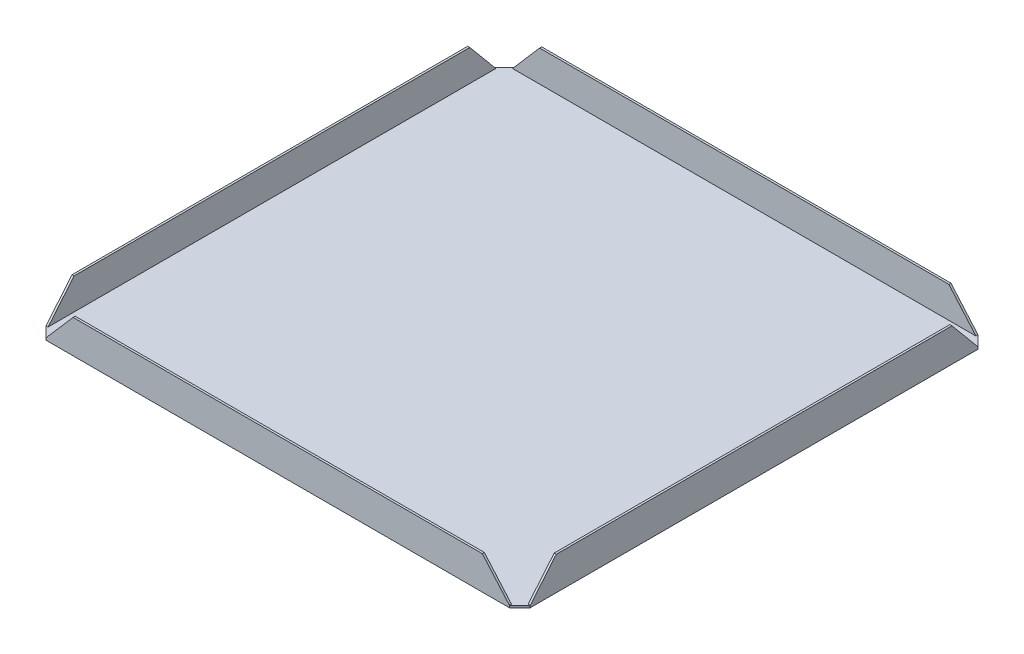
ISO-10303-21;
HEADER;
FILE_DESCRIPTION(('STEP AP214'),'2;1');
FILE_NAME('part.step','',(''),(''),'','','');
FILE_SCHEMA(('AUTOMOTIVE_DESIGN { 1 0 10303 214 1 1 1 1 }'));
ENDSEC;
DATA;
#1=APPLICATION_CONTEXT('core data for automotive mechanical design processes');
#2=APPLICATION_PROTOCOL_DEFINITION('international standard','automotive_design',2000,#1);
#3=PRODUCT_CONTEXT('',#1,'mechanical');
#4=PRODUCT('Part','Part','',(#3));
#5=PRODUCT_RELATED_PRODUCT_CATEGORY('part','',(#4));
#6=PRODUCT_DEFINITION_FORMATION('','',#4);
#7=PRODUCT_DEFINITION_CONTEXT('part definition',#1,'design');
#8=PRODUCT_DEFINITION('design','',#6,#7);
#9=PRODUCT_DEFINITION_SHAPE('','',#8);
#10=(LENGTH_UNIT() NAMED_UNIT(*) SI_UNIT(.MILLI.,.METRE.));
#11=(NAMED_UNIT(*) PLANE_ANGLE_UNIT() SI_UNIT($,.RADIAN.));
#12=(NAMED_UNIT(*) SI_UNIT($,.STERADIAN.) SOLID_ANGLE_UNIT());
#13=UNCERTAINTY_MEASURE_WITH_UNIT(LENGTH_MEASURE(1.E-05),#10,'distance_accuracy_value','');
#14=(GEOMETRIC_REPRESENTATION_CONTEXT(3) GLOBAL_UNCERTAINTY_ASSIGNED_CONTEXT((#13)) GLOBAL_UNIT_ASSIGNED_CONTEXT((#10,
#11,#12)) REPRESENTATION_CONTEXT('',''));
#15=CARTESIAN_POINT('',(0.,0.,0.));
#16=DIRECTION('',(0.,0.,1.));
#17=DIRECTION('',(1.,0.,0.));
#18=AXIS2_PLACEMENT_3D('',#15,#16,#17);
#19=CARTESIAN_POINT('',(0.,2.,0.));
#20=DIRECTION('',(0.,1.,0.));
#21=DIRECTION('',(0.,0.,1.));
#22=AXIS2_PLACEMENT_3D('',#19,#20,#21);
#23=PLANE('',#22);
#24=DIRECTION('',(1.,0.,0.));
#25=VECTOR('',#24,1.);
#26=CARTESIAN_POINT('',(-222.5,2.,-223.));
#27=LINE('',#26,#25);
#28=CARTESIAN_POINT('',(-222.5,2.,-223.));
#29=VERTEX_POINT('',#28);
#30=CARTESIAN_POINT('',(222.5,2.,-223.));
#31=VERTEX_POINT('',#30);
#32=EDGE_CURVE('E51',#29,#31,#27,.T.);
#33=ORIENTED_EDGE('',*,*,#32,.F.);
#34=DIRECTION('',(0.,0.,-1.));
#35=VECTOR('',#34,1.);
#36=CARTESIAN_POINT('',(-222.5,2.,-223.));
#37=LINE('',#36,#35);
#38=CARTESIAN_POINT('',(-222.5,2.,-225.));
#39=VERTEX_POINT('',#38);
#40=EDGE_CURVE('E190',#29,#39,#37,.T.);
#41=ORIENTED_EDGE('',*,*,#40,.T.);
#42=DIRECTION('',(-0.707106781186547,0.,0.707106781186547));
#43=VECTOR('',#42,1.);
#44=CARTESIAN_POINT('',(-232.5,2.,-215.));
#45=LINE('',#44,#43);
#46=CARTESIAN_POINT('',(-232.5,2.,-215.));
#47=VERTEX_POINT('',#46);
#48=EDGE_CURVE('E293',#39,#47,#45,.T.);
#49=ORIENTED_EDGE('',*,*,#48,.T.);
#50=DIRECTION('',(-1.,0.,0.));
#51=VECTOR('',#50,1.);
#52=CARTESIAN_POINT('',(-230.5,2.,-215.));
#53=LINE('',#52,#51);
#54=CARTESIAN_POINT('',(-230.5,2.,-215.));
#55=VERTEX_POINT('',#54);
#56=EDGE_CURVE('E245',#55,#47,#53,.T.);
#57=ORIENTED_EDGE('',*,*,#56,.F.);
#58=DIRECTION('',(0.,0.,1.));
#59=VECTOR('',#58,1.);
#60=CARTESIAN_POINT('',(-230.5,2.,-215.));
#61=LINE('',#60,#59);
#62=CARTESIAN_POINT('',(-230.5,2.,215.));
#63=VERTEX_POINT('',#62);
#64=EDGE_CURVE('E236',#55,#63,#61,.T.);
#65=ORIENTED_EDGE('',*,*,#64,.T.);
#66=DIRECTION('',(-1.,0.,0.));
#67=VECTOR('',#66,1.);
#68=CARTESIAN_POINT('',(-230.5,2.,215.));
#69=LINE('',#68,#67);
#70=CARTESIAN_POINT('',(-232.5,2.,215.));
#71=VERTEX_POINT('',#70);
#72=EDGE_CURVE('E258',#63,#71,#69,.T.);
#73=ORIENTED_EDGE('',*,*,#72,.T.);
#74=DIRECTION('',(0.707106781186547,0.,0.707106781186547));
#75=VECTOR('',#74,1.);
#76=CARTESIAN_POINT('',(-222.5,2.,225.));
#77=LINE('',#76,#75);
#78=CARTESIAN_POINT('',(-222.5,2.,225.));
#79=VERTEX_POINT('',#78);
#80=EDGE_CURVE('E295',#71,#79,#77,.T.);
#81=ORIENTED_EDGE('',*,*,#80,.T.);
#82=DIRECTION('',(0.,0.,1.));
#83=VECTOR('',#82,1.);
#84=CARTESIAN_POINT('',(-222.5,2.,223.));
#85=LINE('',#84,#83);
#86=CARTESIAN_POINT('',(-222.5,2.,223.));
#87=VERTEX_POINT('',#86);
#88=EDGE_CURVE('E276',#87,#79,#85,.T.);
#89=ORIENTED_EDGE('',*,*,#88,.F.);
#90=DIRECTION('',(1.,0.,0.));
#91=VECTOR('',#90,1.);
#92=CARTESIAN_POINT('',(-222.5,2.,223.));
#93=LINE('',#92,#91);
#94=CARTESIAN_POINT('',(222.5,2.,223.));
#95=VERTEX_POINT('',#94);
#96=EDGE_CURVE('E266',#87,#95,#93,.T.);
#97=ORIENTED_EDGE('',*,*,#96,.T.);
#98=DIRECTION('',(0.,0.,1.));
#99=VECTOR('',#98,1.);
#100=CARTESIAN_POINT('',(222.5,2.,223.));
#101=LINE('',#100,#99);
#102=CARTESIAN_POINT('',(222.5,2.,225.));
#103=VERTEX_POINT('',#102);
#104=EDGE_CURVE('E289',#95,#103,#101,.T.);
#105=ORIENTED_EDGE('',*,*,#104,.T.);
#106=DIRECTION('',(0.707106781186547,0.,-0.707106781186547));
#107=VECTOR('',#106,1.);
#108=CARTESIAN_POINT('',(222.5,2.,225.));
#109=LINE('',#108,#107);
#110=CARTESIAN_POINT('',(232.5,2.,215.));
#111=VERTEX_POINT('',#110);
#112=EDGE_CURVE('E299',#103,#111,#109,.T.);
#113=ORIENTED_EDGE('',*,*,#112,.T.);
#114=DIRECTION('',(1.,0.,0.));
#115=VECTOR('',#114,1.);
#116=CARTESIAN_POINT('',(230.5,2.,215.));
#117=LINE('',#116,#115);
#118=CARTESIAN_POINT('',(230.5,2.,215.));
#119=VERTEX_POINT('',#118);
#120=EDGE_CURVE('E225',#119,#111,#117,.T.);
#121=ORIENTED_EDGE('',*,*,#120,.F.);
#122=DIRECTION('',(0.,0.,1.));
#123=VECTOR('',#122,1.);
#124=CARTESIAN_POINT('',(230.5,2.,-215.));
#125=LINE('',#124,#123);
#126=CARTESIAN_POINT('',(230.5,2.,-215.));
#127=VERTEX_POINT('',#126);
#128=EDGE_CURVE('E212',#127,#119,#125,.T.);
#129=ORIENTED_EDGE('',*,*,#128,.F.);
#130=DIRECTION('',(1.,0.,0.));
#131=VECTOR('',#130,1.);
#132=CARTESIAN_POINT('',(230.5,2.,-215.));
#133=LINE('',#132,#131);
#134=CARTESIAN_POINT('',(232.5,2.,-215.));
#135=VERTEX_POINT('',#134);
#136=EDGE_CURVE('E221',#127,#135,#133,.T.);
#137=ORIENTED_EDGE('',*,*,#136,.T.);
#138=DIRECTION('',(-0.707106781186547,0.,-0.707106781186547));
#139=VECTOR('',#138,1.);
#140=CARTESIAN_POINT('',(222.5,2.,-225.));
#141=LINE('',#140,#139);
#142=CARTESIAN_POINT('',(222.5,2.,-225.));
#143=VERTEX_POINT('',#142);
#144=EDGE_CURVE('E301',#135,#143,#141,.T.);
#145=ORIENTED_EDGE('',*,*,#144,.T.);
#146=DIRECTION('',(0.,0.,-1.));
#147=VECTOR('',#146,1.);
#148=CARTESIAN_POINT('',(222.5,2.,-223.));
#149=LINE('',#148,#147);
#150=EDGE_CURVE('E47',#31,#143,#149,.T.);
#151=ORIENTED_EDGE('',*,*,#150,.F.);
#152=EDGE_LOOP('',(#33,#41,#49,#57,#65,#73,#81,#89,#97,#105,#113,#121,#129,#137,#145,#151));
#153=FACE_BOUND('',#152,.T.);
#154=ADVANCED_FACE('F32',(#153),#23,.T.);
#155=CARTESIAN_POINT('',(-222.5,2.,-225.));
#156=DIRECTION('',(0.,0.,1.));
#157=DIRECTION('',(1.,0.,0.));
#158=AXIS2_PLACEMENT_3D('',#155,#156,#157);
#159=PLANE('',#158);
#160=DIRECTION('',(-1.,0.,0.));
#161=VECTOR('',#160,1.);
#162=CARTESIAN_POINT('',(-222.5,0.,-225.));
#163=LINE('',#162,#161);
#164=CARTESIAN_POINT('',(222.5,0.,-225.));
#165=VERTEX_POINT('',#164);
#166=CARTESIAN_POINT('',(-222.5,0.,-225.));
#167=VERTEX_POINT('',#166);
#168=EDGE_CURVE('E286',#165,#167,#163,.T.);
#169=ORIENTED_EDGE('',*,*,#168,.T.);
#170=DIRECTION('',(0.,-1.,0.));
#171=VECTOR('',#170,1.);
#172=CARTESIAN_POINT('',(-222.5,2.,-225.));
#173=LINE('',#172,#171);
#174=EDGE_CURVE('E11',#39,#167,#173,.T.);
#175=ORIENTED_EDGE('',*,*,#174,.F.);
#176=DIRECTION('',(-0.654930538417843,-0.755689082789816,0.));
#177=VECTOR('',#176,1.);
#178=CARTESIAN_POINT('',(-196.5,31.9999999999999,-225.));
#179=LINE('',#178,#177);
#180=CARTESIAN_POINT('',(-196.5,31.9999999999999,-225.));
#181=VERTEX_POINT('',#180);
#182=EDGE_CURVE('E197',#181,#39,#179,.T.);
#183=ORIENTED_EDGE('',*,*,#182,.F.);
#184=DIRECTION('',(-1.,0.,0.));
#185=VECTOR('',#184,1.);
#186=CARTESIAN_POINT('',(196.5,31.9999999999999,-225.));
#187=LINE('',#186,#185);
#188=CARTESIAN_POINT('',(196.5,31.9999999999999,-225.));
#189=VERTEX_POINT('',#188);
#190=EDGE_CURVE('E183',#189,#181,#187,.T.);
#191=ORIENTED_EDGE('',*,*,#190,.F.);
#192=DIRECTION('',(-0.654930538417842,0.755689082789818,0.));
#193=VECTOR('',#192,1.);
#194=CARTESIAN_POINT('',(222.5,2.,-225.));
#195=LINE('',#194,#193);
#196=EDGE_CURVE('E191',#143,#189,#195,.T.);
#197=ORIENTED_EDGE('',*,*,#196,.F.);
#198=DIRECTION('',(0.,-1.,0.));
#199=VECTOR('',#198,1.);
#200=CARTESIAN_POINT('',(222.5,2.,-225.));
#201=LINE('',#200,#199);
#202=EDGE_CURVE('E303',#143,#165,#201,.T.);
#203=ORIENTED_EDGE('',*,*,#202,.T.);
#204=EDGE_LOOP('',(#169,#175,#183,#191,#197,#203));
#205=FACE_BOUND('',#204,.T.);
#206=ADVANCED_FACE('F34',(#205),#159,.F.);
#207=CARTESIAN_POINT('',(-232.5,2.,-215.));
#208=DIRECTION('',(0.707106781186547,0.,0.707106781186547));
#209=DIRECTION('',(0.707106781186548,0.,-0.707106781186548));
#210=AXIS2_PLACEMENT_3D('',#207,#208,#209);
#211=PLANE('',#210);
#212=DIRECTION('',(-0.707106781186547,0.,0.707106781186547));
#213=VECTOR('',#212,1.);
#214=CARTESIAN_POINT('',(-232.5,0.,-215.));
#215=LINE('',#214,#213);
#216=CARTESIAN_POINT('',(-232.5,0.,-215.));
#217=VERTEX_POINT('',#216);
#218=EDGE_CURVE('E306',#167,#217,#215,.T.);
#219=ORIENTED_EDGE('',*,*,#218,.T.);
#220=DIRECTION('',(0.,-1.,0.));
#221=VECTOR('',#220,1.);
#222=CARTESIAN_POINT('',(-232.5,2.,-215.));
#223=LINE('',#222,#221);
#224=EDGE_CURVE('E40',#47,#217,#223,.T.);
#225=ORIENTED_EDGE('',*,*,#224,.F.);
#226=ORIENTED_EDGE('',*,*,#48,.F.);
#227=ORIENTED_EDGE('',*,*,#174,.T.);
#228=EDGE_LOOP('',(#219,#225,#226,#227));
#229=FACE_BOUND('',#228,.T.);
#230=ADVANCED_FACE('F390',(#229),#211,.F.);
#231=CARTESIAN_POINT('',(-232.5,2.,215.));
#232=DIRECTION('',(1.,0.,0.));
#233=DIRECTION('',(0.,0.,-1.));
#234=AXIS2_PLACEMENT_3D('',#231,#232,#233);
#235=PLANE('',#234);
#236=DIRECTION('',(0.,0.,1.));
#237=VECTOR('',#236,1.);
#238=CARTESIAN_POINT('',(-232.5,0.,215.));
#239=LINE('',#238,#237);
#240=CARTESIAN_POINT('',(-232.5,0.,215.));
#241=VERTEX_POINT('',#240);
#242=EDGE_CURVE('E308',#217,#241,#239,.T.);
#243=ORIENTED_EDGE('',*,*,#242,.T.);
#244=DIRECTION('',(0.,-1.,0.));
#245=VECTOR('',#244,1.);
#246=CARTESIAN_POINT('',(-232.5,2.,215.));
#247=LINE('',#246,#245);
#248=EDGE_CURVE('E333',#71,#241,#247,.T.);
#249=ORIENTED_EDGE('',*,*,#248,.F.);
#250=DIRECTION('',(0.,0.768221279597375,-0.64018439966448));
#251=VECTOR('',#250,1.);
#252=CARTESIAN_POINT('',(-232.5,2.,215.));
#253=LINE('',#252,#251);
#254=CARTESIAN_POINT('',(-232.5,32.,190.));
#255=VERTEX_POINT('',#254);
#256=EDGE_CURVE('E248',#71,#255,#253,.T.);
#257=ORIENTED_EDGE('',*,*,#256,.T.);
#258=DIRECTION('',(0.,0.,-1.));
#259=VECTOR('',#258,1.);
#260=CARTESIAN_POINT('',(-232.5,32.,190.));
#261=LINE('',#260,#259);
#262=CARTESIAN_POINT('',(-232.5,32.,-190.));
#263=VERTEX_POINT('',#262);
#264=EDGE_CURVE('E237',#255,#263,#261,.T.);
#265=ORIENTED_EDGE('',*,*,#264,.T.);
#266=DIRECTION('',(0.,-0.768221279597375,-0.64018439966448));
#267=VECTOR('',#266,1.);
#268=CARTESIAN_POINT('',(-232.5,32.,-190.));
#269=LINE('',#268,#267);
#270=EDGE_CURVE('E224',#263,#47,#269,.T.);
#271=ORIENTED_EDGE('',*,*,#270,.T.);
#272=ORIENTED_EDGE('',*,*,#224,.T.);
#273=EDGE_LOOP('',(#243,#249,#257,#265,#271,#272));
#274=FACE_BOUND('',#273,.T.);
#275=ADVANCED_FACE('F339',(#274),#235,.F.);
#276=CARTESIAN_POINT('',(-222.5,2.,225.));
#277=DIRECTION('',(0.707106781186547,0.,-0.707106781186547));
#278=DIRECTION('',(-0.707106781186548,0.,-0.707106781186548));
#279=AXIS2_PLACEMENT_3D('',#276,#277,#278);
#280=PLANE('',#279);
#281=DIRECTION('',(0.707106781186547,0.,0.707106781186547));
#282=VECTOR('',#281,1.);
#283=CARTESIAN_POINT('',(-222.5,0.,225.));
#284=LINE('',#283,#282);
#285=CARTESIAN_POINT('',(-222.5,0.,225.));
#286=VERTEX_POINT('',#285);
#287=EDGE_CURVE('E310',#241,#286,#284,.T.);
#288=ORIENTED_EDGE('',*,*,#287,.T.);
#289=DIRECTION('',(0.,-1.,0.));
#290=VECTOR('',#289,1.);
#291=CARTESIAN_POINT('',(-222.5,2.,225.));
#292=LINE('',#291,#290);
#293=EDGE_CURVE('E330',#79,#286,#292,.T.);
#294=ORIENTED_EDGE('',*,*,#293,.F.);
#295=ORIENTED_EDGE('',*,*,#80,.F.);
#296=ORIENTED_EDGE('',*,*,#248,.T.);
#297=EDGE_LOOP('',(#288,#294,#295,#296));
#298=FACE_BOUND('',#297,.T.);
#299=ADVANCED_FACE('F352',(#298),#280,.F.);
#300=CARTESIAN_POINT('',(-222.5,2.,225.));
#301=DIRECTION('',(0.,0.,-1.));
#302=DIRECTION('',(-1.,0.,0.));
#303=AXIS2_PLACEMENT_3D('',#300,#301,#302);
#304=PLANE('',#303);
#305=DIRECTION('',(1.,0.,0.));
#306=VECTOR('',#305,1.);
#307=CARTESIAN_POINT('',(-222.5,0.,225.));
#308=LINE('',#307,#306);
#309=CARTESIAN_POINT('',(222.5,0.,225.));
#310=VERTEX_POINT('',#309);
#311=EDGE_CURVE('E312',#286,#310,#308,.T.);
#312=ORIENTED_EDGE('',*,*,#311,.T.);
#313=DIRECTION('',(0.,-1.,0.));
#314=VECTOR('',#313,1.);
#315=CARTESIAN_POINT('',(222.5,2.,225.));
#316=LINE('',#315,#314);
#317=EDGE_CURVE('E327',#103,#310,#316,.T.);
#318=ORIENTED_EDGE('',*,*,#317,.F.);
#319=DIRECTION('',(-0.654930538417842,0.755689082789818,0.));
#320=VECTOR('',#319,1.);
#321=CARTESIAN_POINT('',(222.5,2.,225.));
#322=LINE('',#321,#320);
#323=CARTESIAN_POINT('',(196.5,31.9999999999999,225.));
#324=VERTEX_POINT('',#323);
#325=EDGE_CURVE('E279',#103,#324,#322,.T.);
#326=ORIENTED_EDGE('',*,*,#325,.T.);
#327=DIRECTION('',(-1.,0.,0.));
#328=VECTOR('',#327,1.);
#329=CARTESIAN_POINT('',(196.5,31.9999999999999,225.));
#330=LINE('',#329,#328);
#331=CARTESIAN_POINT('',(-196.5,31.9999999999999,225.));
#332=VERTEX_POINT('',#331);
#333=EDGE_CURVE('E267',#324,#332,#330,.T.);
#334=ORIENTED_EDGE('',*,*,#333,.T.);
#335=DIRECTION('',(-0.654930538417843,-0.755689082789816,0.));
#336=VECTOR('',#335,1.);
#337=CARTESIAN_POINT('',(-196.5,31.9999999999999,225.));
#338=LINE('',#337,#336);
#339=EDGE_CURVE('E255',#332,#79,#338,.T.);
#340=ORIENTED_EDGE('',*,*,#339,.T.);
#341=ORIENTED_EDGE('',*,*,#293,.T.);
#342=EDGE_LOOP('',(#312,#318,#326,#334,#340,#341));
#343=FACE_BOUND('',#342,.T.);
#344=ADVANCED_FACE('F354',(#343),#304,.F.);
#345=CARTESIAN_POINT('',(222.5,2.,225.));
#346=DIRECTION('',(-0.707106781186547,0.,-0.707106781186547));
#347=DIRECTION('',(-0.707106781186548,0.,0.707106781186548));
#348=AXIS2_PLACEMENT_3D('',#345,#346,#347);
#349=PLANE('',#348);
#350=DIRECTION('',(0.707106781186547,0.,-0.707106781186547));
#351=VECTOR('',#350,1.);
#352=CARTESIAN_POINT('',(222.5,0.,225.));
#353=LINE('',#352,#351);
#354=CARTESIAN_POINT('',(232.5,0.,215.));
#355=VERTEX_POINT('',#354);
#356=EDGE_CURVE('E314',#310,#355,#353,.T.);
#357=ORIENTED_EDGE('',*,*,#356,.T.);
#358=DIRECTION('',(0.,-1.,0.));
#359=VECTOR('',#358,1.);
#360=CARTESIAN_POINT('',(232.5,2.,215.));
#361=LINE('',#360,#359);
#362=EDGE_CURVE('E324',#111,#355,#361,.T.);
#363=ORIENTED_EDGE('',*,*,#362,.F.);
#364=ORIENTED_EDGE('',*,*,#112,.F.);
#365=ORIENTED_EDGE('',*,*,#317,.T.);
#366=EDGE_LOOP('',(#357,#363,#364,#365));
#367=FACE_BOUND('',#366,.T.);
#368=ADVANCED_FACE('F405',(#367),#349,.F.);
#369=CARTESIAN_POINT('',(232.5,2.,215.));
#370=DIRECTION('',(-1.,0.,0.));
#371=DIRECTION('',(0.,0.,1.));
#372=AXIS2_PLACEMENT_3D('',#369,#370,#371);
#373=PLANE('',#372);
#374=DIRECTION('',(0.,0.,-1.));
#375=VECTOR('',#374,1.);
#376=CARTESIAN_POINT('',(232.5,0.,215.));
#377=LINE('',#376,#375);
#378=CARTESIAN_POINT('',(232.5,0.,-215.));
#379=VERTEX_POINT('',#378);
#380=EDGE_CURVE('E316',#355,#379,#377,.T.);
#381=ORIENTED_EDGE('',*,*,#380,.T.);
#382=DIRECTION('',(0.,-1.,0.));
#383=VECTOR('',#382,1.);
#384=CARTESIAN_POINT('',(232.5,2.,-215.));
#385=LINE('',#384,#383);
#386=EDGE_CURVE('E321',#135,#379,#385,.T.);
#387=ORIENTED_EDGE('',*,*,#386,.F.);
#388=DIRECTION('',(0.,-0.768221279597375,-0.64018439966448));
#389=VECTOR('',#388,1.);
#390=CARTESIAN_POINT('',(232.5,32.,-190.));
#391=LINE('',#390,#389);
#392=CARTESIAN_POINT('',(232.5,32.,-190.));
#393=VERTEX_POINT('',#392);
#394=EDGE_CURVE('E201',#393,#135,#391,.T.);
#395=ORIENTED_EDGE('',*,*,#394,.F.);
#396=DIRECTION('',(0.,0.,-1.));
#397=VECTOR('',#396,1.);
#398=CARTESIAN_POINT('',(232.5,32.,190.));
#399=LINE('',#398,#397);
#400=CARTESIAN_POINT('',(232.5,32.,190.));
#401=VERTEX_POINT('',#400);
#402=EDGE_CURVE('E218',#401,#393,#399,.T.);
#403=ORIENTED_EDGE('',*,*,#402,.F.);
#404=DIRECTION('',(0.,0.768221279597375,-0.64018439966448));
#405=VECTOR('',#404,1.);
#406=CARTESIAN_POINT('',(232.5,2.,215.));
#407=LINE('',#406,#405);
#408=EDGE_CURVE('E208',#111,#401,#407,.T.);
#409=ORIENTED_EDGE('',*,*,#408,.F.);
#410=ORIENTED_EDGE('',*,*,#362,.T.);
#411=EDGE_LOOP('',(#381,#387,#395,#403,#409,#410));
#412=FACE_BOUND('',#411,.T.);
#413=ADVANCED_FACE('F401',(#412),#373,.F.);
#414=CARTESIAN_POINT('',(222.5,2.,-225.));
#415=DIRECTION('',(-0.707106781186547,0.,0.707106781186547));
#416=DIRECTION('',(0.707106781186548,0.,0.707106781186548));
#417=AXIS2_PLACEMENT_3D('',#414,#415,#416);
#418=PLANE('',#417);
#419=DIRECTION('',(-0.707106781186547,0.,-0.707106781186547));
#420=VECTOR('',#419,1.);
#421=CARTESIAN_POINT('',(222.5,0.,-225.));
#422=LINE('',#421,#420);
#423=EDGE_CURVE('E296',#379,#165,#422,.T.);
#424=ORIENTED_EDGE('',*,*,#423,.T.);
#425=ORIENTED_EDGE('',*,*,#202,.F.);
#426=ORIENTED_EDGE('',*,*,#144,.F.);
#427=ORIENTED_EDGE('',*,*,#386,.T.);
#428=EDGE_LOOP('',(#424,#425,#426,#427));
#429=FACE_BOUND('',#428,.T.);
#430=ADVANCED_FACE('F398',(#429),#418,.F.);
#431=CARTESIAN_POINT('',(0.,0.,0.));
#432=DIRECTION('',(0.,1.,0.));
#433=DIRECTION('',(0.,0.,1.));
#434=AXIS2_PLACEMENT_3D('',#431,#432,#433);
#435=PLANE('',#434);
#436=ORIENTED_EDGE('',*,*,#168,.F.);
#437=ORIENTED_EDGE('',*,*,#423,.F.);
#438=ORIENTED_EDGE('',*,*,#380,.F.);
#439=ORIENTED_EDGE('',*,*,#356,.F.);
#440=ORIENTED_EDGE('',*,*,#311,.F.);
#441=ORIENTED_EDGE('',*,*,#287,.F.);
#442=ORIENTED_EDGE('',*,*,#242,.F.);
#443=ORIENTED_EDGE('',*,*,#218,.F.);
#444=EDGE_LOOP('',(#436,#437,#438,#439,#440,#441,#442,#443));
#445=FACE_BOUND('',#444,.T.);
#446=ADVANCED_FACE('F347',(#445),#435,.F.);
#447=CARTESIAN_POINT('',(-196.5,31.9999999999999,223.));
#448=DIRECTION('',(-0.755689082789816,0.654930538417843,0.));
#449=DIRECTION('',(-0.654930538417843,-0.755689082789816,0.));
#450=AXIS2_PLACEMENT_3D('',#447,#448,#449);
#451=PLANE('',#450);
#452=ORIENTED_EDGE('',*,*,#339,.F.);
#453=DIRECTION('',(0.,0.,1.));
#454=VECTOR('',#453,1.);
#455=CARTESIAN_POINT('',(-196.5,31.9999999999999,223.));
#456=LINE('',#455,#454);
#457=CARTESIAN_POINT('',(-196.5,31.9999999999999,223.));
#458=VERTEX_POINT('',#457);
#459=EDGE_CURVE('E284',#458,#332,#456,.T.);
#460=ORIENTED_EDGE('',*,*,#459,.F.);
#461=DIRECTION('',(-0.654930538417843,-0.755689082789816,0.));
#462=VECTOR('',#461,1.);
#463=CARTESIAN_POINT('',(-196.5,31.9999999999999,223.));
#464=LINE('',#463,#462);
#465=EDGE_CURVE('E263',#458,#87,#464,.T.);
#466=ORIENTED_EDGE('',*,*,#465,.T.);
#467=ORIENTED_EDGE('',*,*,#88,.T.);
#468=EDGE_LOOP('',(#452,#460,#466,#467));
#469=FACE_BOUND('',#468,.T.);
#470=ADVANCED_FACE('F394',(#469),#451,.T.);
#471=CARTESIAN_POINT('',(196.5,31.9999999999999,223.));
#472=DIRECTION('',(0.,1.,0.));
#473=DIRECTION('',(0.,0.,1.));
#474=AXIS2_PLACEMENT_3D('',#471,#472,#473);
#475=PLANE('',#474);
#476=ORIENTED_EDGE('',*,*,#333,.F.);
#477=DIRECTION('',(0.,0.,1.));
#478=VECTOR('',#477,1.);
#479=CARTESIAN_POINT('',(196.5,31.9999999999999,223.));
#480=LINE('',#479,#478);
#481=CARTESIAN_POINT('',(196.5,31.9999999999999,223.));
#482=VERTEX_POINT('',#481);
#483=EDGE_CURVE('E287',#482,#324,#480,.T.);
#484=ORIENTED_EDGE('',*,*,#483,.F.);
#485=DIRECTION('',(-1.,0.,0.));
#486=VECTOR('',#485,1.);
#487=CARTESIAN_POINT('',(196.5,31.9999999999999,223.));
#488=LINE('',#487,#486);
#489=EDGE_CURVE('E273',#482,#458,#488,.T.);
#490=ORIENTED_EDGE('',*,*,#489,.T.);
#491=ORIENTED_EDGE('',*,*,#459,.T.);
#492=EDGE_LOOP('',(#476,#484,#490,#491));
#493=FACE_BOUND('',#492,.T.);
#494=ADVANCED_FACE('F534',(#493),#475,.T.);
#495=CARTESIAN_POINT('',(222.5,2.,223.));
#496=DIRECTION('',(0.755689082789818,0.654930538417842,0.));
#497=DIRECTION('',(-0.654930538417842,0.755689082789818,0.));
#498=AXIS2_PLACEMENT_3D('',#495,#496,#497);
#499=PLANE('',#498);
#500=ORIENTED_EDGE('',*,*,#325,.F.);
#501=ORIENTED_EDGE('',*,*,#104,.F.);
#502=DIRECTION('',(-0.654930538417842,0.755689082789818,0.));
#503=VECTOR('',#502,1.);
#504=CARTESIAN_POINT('',(222.5,2.,223.));
#505=LINE('',#504,#503);
#506=EDGE_CURVE('E270',#95,#482,#505,.T.);
#507=ORIENTED_EDGE('',*,*,#506,.T.);
#508=ORIENTED_EDGE('',*,*,#483,.T.);
#509=EDGE_LOOP('',(#500,#501,#507,#508));
#510=FACE_BOUND('',#509,.T.);
#511=ADVANCED_FACE('F541',(#510),#499,.T.);
#512=CARTESIAN_POINT('',(0.,0.,223.));
#513=DIRECTION('',(0.,0.,-1.));
#514=DIRECTION('',(-1.,0.,0.));
#515=AXIS2_PLACEMENT_3D('',#512,#513,#514);
#516=PLANE('',#515);
#517=ORIENTED_EDGE('',*,*,#465,.F.);
#518=ORIENTED_EDGE('',*,*,#489,.F.);
#519=ORIENTED_EDGE('',*,*,#506,.F.);
#520=ORIENTED_EDGE('',*,*,#96,.F.);
#521=EDGE_LOOP('',(#517,#518,#519,#520));
#522=FACE_BOUND('',#521,.T.);
#523=ADVANCED_FACE('F549',(#522),#516,.T.);
#524=CARTESIAN_POINT('',(-230.5,32.,-190.));
#525=DIRECTION('',(0.,0.64018439966448,-0.768221279597376));
#526=DIRECTION('',(0.,0.768221279597376,0.64018439966448));
#527=AXIS2_PLACEMENT_3D('',#524,#525,#526);
#528=PLANE('',#527);
#529=ORIENTED_EDGE('',*,*,#270,.F.);
#530=DIRECTION('',(-1.,0.,0.));
#531=VECTOR('',#530,1.);
#532=CARTESIAN_POINT('',(-230.5,32.,-190.));
#533=LINE('',#532,#531);
#534=CARTESIAN_POINT('',(-230.5,32.,-190.));
#535=VERTEX_POINT('',#534);
#536=EDGE_CURVE('E253',#535,#263,#533,.T.);
#537=ORIENTED_EDGE('',*,*,#536,.F.);
#538=DIRECTION('',(0.,-0.768221279597375,-0.64018439966448));
#539=VECTOR('',#538,1.);
#540=CARTESIAN_POINT('',(-230.5,32.,-190.));
#541=LINE('',#540,#539);
#542=EDGE_CURVE('E233',#535,#55,#541,.T.);
#543=ORIENTED_EDGE('',*,*,#542,.T.);
#544=ORIENTED_EDGE('',*,*,#56,.T.);
#545=EDGE_LOOP('',(#529,#537,#543,#544));
#546=FACE_BOUND('',#545,.T.);
#547=ADVANCED_FACE('F369',(#546),#528,.T.);
#548=CARTESIAN_POINT('',(-230.5,32.,190.));
#549=DIRECTION('',(0.,1.,0.));
#550=DIRECTION('',(0.,0.,1.));
#551=AXIS2_PLACEMENT_3D('',#548,#549,#550);
#552=PLANE('',#551);
#553=ORIENTED_EDGE('',*,*,#264,.F.);
#554=DIRECTION('',(-1.,0.,0.));
#555=VECTOR('',#554,1.);
#556=CARTESIAN_POINT('',(-230.5,32.,190.));
#557=LINE('',#556,#555);
#558=CARTESIAN_POINT('',(-230.5,32.,190.));
#559=VERTEX_POINT('',#558);
#560=EDGE_CURVE('E256',#559,#255,#557,.T.);
#561=ORIENTED_EDGE('',*,*,#560,.F.);
#562=DIRECTION('',(0.,0.,-1.));
#563=VECTOR('',#562,1.);
#564=CARTESIAN_POINT('',(-230.5,32.,190.));
#565=LINE('',#564,#563);
#566=EDGE_CURVE('E242',#559,#535,#565,.T.);
#567=ORIENTED_EDGE('',*,*,#566,.T.);
#568=ORIENTED_EDGE('',*,*,#536,.T.);
#569=EDGE_LOOP('',(#553,#561,#567,#568));
#570=FACE_BOUND('',#569,.T.);
#571=ADVANCED_FACE('F365',(#570),#552,.T.);
#572=CARTESIAN_POINT('',(-230.5,2.,215.));
#573=DIRECTION('',(0.,0.64018439966448,0.768221279597376));
#574=DIRECTION('',(0.,-0.768221279597376,0.64018439966448));
#575=AXIS2_PLACEMENT_3D('',#572,#573,#574);
#576=PLANE('',#575);
#577=ORIENTED_EDGE('',*,*,#256,.F.);
#578=ORIENTED_EDGE('',*,*,#72,.F.);
#579=DIRECTION('',(0.,0.768221279597375,-0.64018439966448));
#580=VECTOR('',#579,1.);
#581=CARTESIAN_POINT('',(-230.5,2.,215.));
#582=LINE('',#581,#580);
#583=EDGE_CURVE('E239',#63,#559,#582,.T.);
#584=ORIENTED_EDGE('',*,*,#583,.T.);
#585=ORIENTED_EDGE('',*,*,#560,.T.);
#586=EDGE_LOOP('',(#577,#578,#584,#585));
#587=FACE_BOUND('',#586,.T.);
#588=ADVANCED_FACE('F374',(#587),#576,.T.);
#589=CARTESIAN_POINT('',(-230.5,0.,0.));
#590=DIRECTION('',(1.,0.,0.));
#591=DIRECTION('',(0.,0.,-1.));
#592=AXIS2_PLACEMENT_3D('',#589,#590,#591);
#593=PLANE('',#592);
#594=ORIENTED_EDGE('',*,*,#542,.F.);
#595=ORIENTED_EDGE('',*,*,#566,.F.);
#596=ORIENTED_EDGE('',*,*,#583,.F.);
#597=ORIENTED_EDGE('',*,*,#64,.F.);
#598=EDGE_LOOP('',(#594,#595,#596,#597));
#599=FACE_BOUND('',#598,.T.);
#600=ADVANCED_FACE('F373',(#599),#593,.T.);
#601=CARTESIAN_POINT('',(230.5,32.,-190.));
#602=DIRECTION('',(0.,-0.64018439966448,0.768221279597376));
#603=DIRECTION('',(0.,-0.768221279597376,-0.64018439966448));
#604=AXIS2_PLACEMENT_3D('',#601,#602,#603);
#605=PLANE('',#604);
#606=ORIENTED_EDGE('',*,*,#394,.T.);
#607=ORIENTED_EDGE('',*,*,#136,.F.);
#608=DIRECTION('',(0.,-0.768221279597375,-0.64018439966448));
#609=VECTOR('',#608,1.);
#610=CARTESIAN_POINT('',(230.5,32.,-190.));
#611=LINE('',#610,#609);
#612=CARTESIAN_POINT('',(230.5,32.,-190.));
#613=VERTEX_POINT('',#612);
#614=EDGE_CURVE('E204',#613,#127,#611,.T.);
#615=ORIENTED_EDGE('',*,*,#614,.F.);
#616=DIRECTION('',(1.,0.,0.));
#617=VECTOR('',#616,1.);
#618=CARTESIAN_POINT('',(230.5,32.,-190.));
#619=LINE('',#618,#617);
#620=EDGE_CURVE('E215',#613,#393,#619,.T.);
#621=ORIENTED_EDGE('',*,*,#620,.T.);
#622=EDGE_LOOP('',(#606,#607,#615,#621));
#623=FACE_BOUND('',#622,.T.);
#624=ADVANCED_FACE('F381',(#623),#605,.F.);
#625=CARTESIAN_POINT('',(230.5,2.,215.));
#626=DIRECTION('',(0.,-0.64018439966448,-0.768221279597376));
#627=DIRECTION('',(0.,0.768221279597376,-0.64018439966448));
#628=AXIS2_PLACEMENT_3D('',#625,#626,#627);
#629=PLANE('',#628);
#630=ORIENTED_EDGE('',*,*,#408,.T.);
#631=DIRECTION('',(1.,0.,0.));
#632=VECTOR('',#631,1.);
#633=CARTESIAN_POINT('',(230.5,32.,190.));
#634=LINE('',#633,#632);
#635=CARTESIAN_POINT('',(230.5,32.,190.));
#636=VERTEX_POINT('',#635);
#637=EDGE_CURVE('E228',#636,#401,#634,.T.);
#638=ORIENTED_EDGE('',*,*,#637,.F.);
#639=DIRECTION('',(0.,0.768221279597375,-0.64018439966448));
#640=VECTOR('',#639,1.);
#641=CARTESIAN_POINT('',(230.5,2.,215.));
#642=LINE('',#641,#640);
#643=EDGE_CURVE('E210',#119,#636,#642,.T.);
#644=ORIENTED_EDGE('',*,*,#643,.F.);
#645=ORIENTED_EDGE('',*,*,#120,.T.);
#646=EDGE_LOOP('',(#630,#638,#644,#645));
#647=FACE_BOUND('',#646,.T.);
#648=ADVANCED_FACE('F436',(#647),#629,.F.);
#649=CARTESIAN_POINT('',(230.5,32.,190.));
#650=DIRECTION('',(0.,-1.,0.));
#651=DIRECTION('',(0.,0.,-1.));
#652=AXIS2_PLACEMENT_3D('',#649,#650,#651);
#653=PLANE('',#652);
#654=ORIENTED_EDGE('',*,*,#402,.T.);
#655=ORIENTED_EDGE('',*,*,#620,.F.);
#656=DIRECTION('',(0.,0.,-1.));
#657=VECTOR('',#656,1.);
#658=CARTESIAN_POINT('',(230.5,32.,190.));
#659=LINE('',#658,#657);
#660=EDGE_CURVE('E207',#636,#613,#659,.T.);
#661=ORIENTED_EDGE('',*,*,#660,.F.);
#662=ORIENTED_EDGE('',*,*,#637,.T.);
#663=EDGE_LOOP('',(#654,#655,#661,#662));
#664=FACE_BOUND('',#663,.T.);
#665=ADVANCED_FACE('F431',(#664),#653,.F.);
#666=CARTESIAN_POINT('',(230.5,0.,0.));
#667=DIRECTION('',(-1.,0.,0.));
#668=DIRECTION('',(0.,0.,-1.));
#669=AXIS2_PLACEMENT_3D('',#666,#667,#668);
#670=PLANE('',#669);
#671=ORIENTED_EDGE('',*,*,#614,.T.);
#672=ORIENTED_EDGE('',*,*,#128,.T.);
#673=ORIENTED_EDGE('',*,*,#643,.T.);
#674=ORIENTED_EDGE('',*,*,#660,.T.);
#675=EDGE_LOOP('',(#671,#672,#673,#674));
#676=FACE_BOUND('',#675,.T.);
#677=ADVANCED_FACE('F440',(#676),#670,.T.);
#678=CARTESIAN_POINT('',(-196.5,31.9999999999999,-223.));
#679=DIRECTION('',(0.755689082789816,-0.654930538417843,0.));
#680=DIRECTION('',(0.654930538417843,0.755689082789816,0.));
#681=AXIS2_PLACEMENT_3D('',#678,#679,#680);
#682=PLANE('',#681);
#683=ORIENTED_EDGE('',*,*,#182,.T.);
#684=ORIENTED_EDGE('',*,*,#40,.F.);
#685=DIRECTION('',(-0.654930538417843,-0.755689082789816,0.));
#686=VECTOR('',#685,1.);
#687=CARTESIAN_POINT('',(-196.5,31.9999999999999,-223.));
#688=LINE('',#687,#686);
#689=CARTESIAN_POINT('',(-196.5,31.9999999999999,-223.));
#690=VERTEX_POINT('',#689);
#691=EDGE_CURVE('E171',#690,#29,#688,.T.);
#692=ORIENTED_EDGE('',*,*,#691,.F.);
#693=DIRECTION('',(0.,0.,-1.));
#694=VECTOR('',#693,1.);
#695=CARTESIAN_POINT('',(-196.5,31.9999999999999,-223.));
#696=LINE('',#695,#694);
#697=EDGE_CURVE('E180',#690,#181,#696,.T.);
#698=ORIENTED_EDGE('',*,*,#697,.T.);
#699=EDGE_LOOP('',(#683,#684,#692,#698));
#700=FACE_BOUND('',#699,.T.);
#701=ADVANCED_FACE('F189',(#700),#682,.F.);
#702=CARTESIAN_POINT('',(222.5,2.,-223.));
#703=DIRECTION('',(-0.755689082789818,-0.654930538417842,0.));
#704=DIRECTION('',(0.654930538417842,-0.755689082789818,0.));
#705=AXIS2_PLACEMENT_3D('',#702,#703,#704);
#706=PLANE('',#705);
#707=ORIENTED_EDGE('',*,*,#196,.T.);
#708=DIRECTION('',(0.,0.,-1.));
#709=VECTOR('',#708,1.);
#710=CARTESIAN_POINT('',(196.5,31.9999999999999,-223.));
#711=LINE('',#710,#709);
#712=CARTESIAN_POINT('',(196.5,31.9999999999999,-223.));
#713=VERTEX_POINT('',#712);
#714=EDGE_CURVE('E187',#713,#189,#711,.T.);
#715=ORIENTED_EDGE('',*,*,#714,.F.);
#716=DIRECTION('',(-0.654930538417842,0.755689082789818,0.));
#717=VECTOR('',#716,1.);
#718=CARTESIAN_POINT('',(222.5,2.,-223.));
#719=LINE('',#718,#717);
#720=EDGE_CURVE('E174',#31,#713,#719,.T.);
#721=ORIENTED_EDGE('',*,*,#720,.F.);
#722=ORIENTED_EDGE('',*,*,#150,.T.);
#723=EDGE_LOOP('',(#707,#715,#721,#722));
#724=FACE_BOUND('',#723,.T.);
#725=ADVANCED_FACE('F447',(#724),#706,.F.);
#726=CARTESIAN_POINT('',(196.5,31.9999999999999,-223.));
#727=DIRECTION('',(0.,-1.,0.));
#728=DIRECTION('',(0.,0.,-1.));
#729=AXIS2_PLACEMENT_3D('',#726,#727,#728);
#730=PLANE('',#729);
#731=ORIENTED_EDGE('',*,*,#190,.T.);
#732=ORIENTED_EDGE('',*,*,#697,.F.);
#733=DIRECTION('',(-1.,0.,0.));
#734=VECTOR('',#733,1.);
#735=CARTESIAN_POINT('',(196.5,31.9999999999999,-223.));
#736=LINE('',#735,#734);
#737=EDGE_CURVE('E167',#713,#690,#736,.T.);
#738=ORIENTED_EDGE('',*,*,#737,.F.);
#739=ORIENTED_EDGE('',*,*,#714,.T.);
#740=EDGE_LOOP('',(#731,#732,#738,#739));
#741=FACE_BOUND('',#740,.T.);
#742=ADVANCED_FACE('F181',(#741),#730,.F.);
#743=CARTESIAN_POINT('',(0.,0.,-223.));
#744=DIRECTION('',(0.,0.,1.));
#745=DIRECTION('',(-1.,0.,0.));
#746=AXIS2_PLACEMENT_3D('',#743,#744,#745);
#747=PLANE('',#746);
#748=ORIENTED_EDGE('',*,*,#691,.T.);
#749=ORIENTED_EDGE('',*,*,#32,.T.);
#750=ORIENTED_EDGE('',*,*,#720,.T.);
#751=ORIENTED_EDGE('',*,*,#737,.T.);
#752=EDGE_LOOP('',(#748,#749,#750,#751));
#753=FACE_BOUND('',#752,.T.);
#754=ADVANCED_FACE('F169',(#753),#747,.T.);
#755=CLOSED_SHELL('',(#154,#206,#230,#275,#299,#344,#368,#413,#430,#446,#470,#494,#511,#523,
#547,#571,#588,#600,#624,#648,#665,#677,#701,#725,#742,#754));
#756=MANIFOLD_SOLID_BREP('B2',#755);
#757=ADVANCED_BREP_SHAPE_REPRESENTATION('',(#18,#756),#14);
#758=SHAPE_DEFINITION_REPRESENTATION(#9,#757);
ENDSEC;
END-ISO-10303-21;
